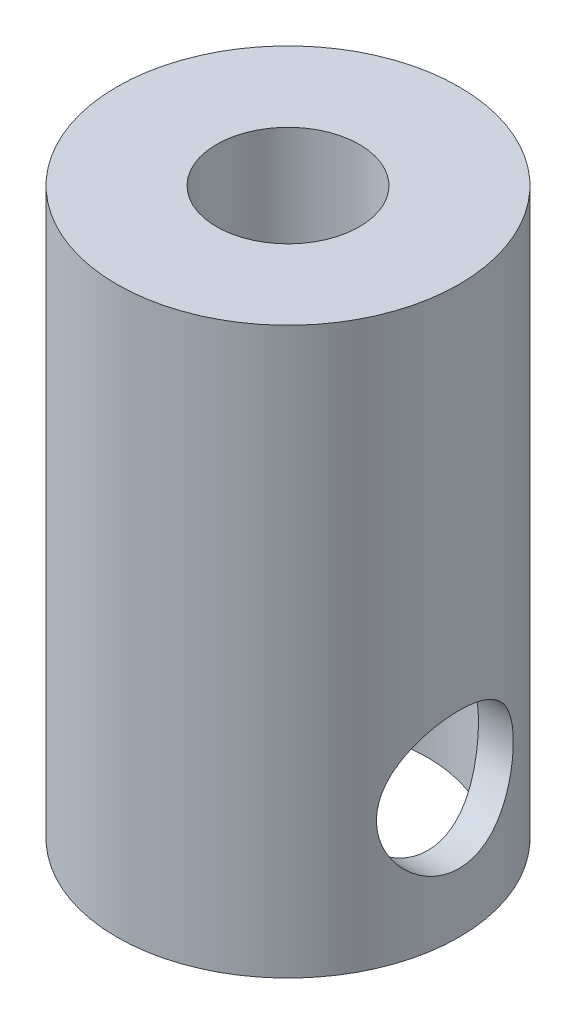
ISO-10303-21;
HEADER;
FILE_DESCRIPTION(('STEP AP214'),'2;1');
FILE_NAME('part.step','',(''),(''),'','','');
FILE_SCHEMA(('AUTOMOTIVE_DESIGN { 1 0 10303 214 1 1 1 1 }'));
ENDSEC;
DATA;
#1=APPLICATION_CONTEXT('core data for automotive mechanical design processes');
#2=APPLICATION_PROTOCOL_DEFINITION('international standard','automotive_design',2000,#1);
#3=PRODUCT_CONTEXT('',#1,'mechanical');
#4=PRODUCT('Part','Part','',(#3));
#5=PRODUCT_RELATED_PRODUCT_CATEGORY('part','',(#4));
#6=PRODUCT_DEFINITION_FORMATION('','',#4);
#7=PRODUCT_DEFINITION_CONTEXT('part definition',#1,'design');
#8=PRODUCT_DEFINITION('design','',#6,#7);
#9=PRODUCT_DEFINITION_SHAPE('','',#8);
#10=(LENGTH_UNIT() NAMED_UNIT(*) SI_UNIT(.MILLI.,.METRE.));
#11=(NAMED_UNIT(*) PLANE_ANGLE_UNIT() SI_UNIT($,.RADIAN.));
#12=(NAMED_UNIT(*) SI_UNIT($,.STERADIAN.) SOLID_ANGLE_UNIT());
#13=UNCERTAINTY_MEASURE_WITH_UNIT(LENGTH_MEASURE(1.E-05),#10,'distance_accuracy_value','');
#14=(GEOMETRIC_REPRESENTATION_CONTEXT(3) GLOBAL_UNCERTAINTY_ASSIGNED_CONTEXT((#13)) GLOBAL_UNIT_ASSIGNED_CONTEXT((#10,
#11,#12)) REPRESENTATION_CONTEXT('',''));
#15=CARTESIAN_POINT('',(0.,0.,0.));
#16=DIRECTION('',(0.,0.,1.));
#17=DIRECTION('',(1.,0.,0.));
#18=AXIS2_PLACEMENT_3D('',#15,#16,#17);
#19=CARTESIAN_POINT('',(0.,0.,0.));
#20=DIRECTION('',(0.,1.,0.));
#21=DIRECTION('',(0.,0.,1.));
#22=AXIS2_PLACEMENT_3D('',#19,#20,#21);
#23=PLANE('',#22);
#24=CARTESIAN_POINT('',(0.,0.,0.));
#25=DIRECTION('',(0.,1.,0.));
#26=DIRECTION('',(0.,0.,1.));
#27=AXIS2_PLACEMENT_3D('',#24,#25,#26);
#28=CIRCLE('',#27,5.75);
#29=CARTESIAN_POINT('',(0.,0.,5.75));
#30=VERTEX_POINT('',#29);
#31=EDGE_CURVE('E46',#30,#30,#28,.T.);
#32=ORIENTED_EDGE('',*,*,#31,.F.);
#33=EDGE_LOOP('',(#32));
#34=FACE_BOUND('',#33,.T.);
#35=CARTESIAN_POINT('',(0.,0.,0.));
#36=DIRECTION('',(0.,1.,0.));
#37=DIRECTION('',(0.,0.,1.));
#38=AXIS2_PLACEMENT_3D('',#35,#36,#37);
#39=CIRCLE('',#38,4.7);
#40=CARTESIAN_POINT('',(0.,0.,4.7));
#41=VERTEX_POINT('',#40);
#42=EDGE_CURVE('E50',#41,#41,#39,.T.);
#43=ORIENTED_EDGE('',*,*,#42,.T.);
#44=EDGE_LOOP('',(#43));
#45=FACE_BOUND('',#44,.T.);
#46=ADVANCED_FACE('F37',(#34,#45),#23,.F.);
#47=CARTESIAN_POINT('',(0.,10.,0.));
#48=DIRECTION('',(0.,-1.,0.));
#49=DIRECTION('',(0.,0.,-1.));
#50=AXIS2_PLACEMENT_3D('',#47,#48,#49);
#51=CYLINDRICAL_SURFACE('',#50,5.75);
#52=CARTESIAN_POINT('',(-5.75,2.,0.));
#53=CARTESIAN_POINT('',(-5.74999388438572,2.00000823723326,-0.123624281690028));
#54=CARTESIAN_POINT('',(-5.74596749221181,2.01002458534458,-0.247450413823076));
#55=CARTESIAN_POINT('',(-5.73025910132103,2.04973569086473,-0.491618982012242));
#56=CARTESIAN_POINT('',(-5.71855629199848,2.07948394351581,-0.61195101696212));
#57=CARTESIAN_POINT('',(-5.68875356845851,2.15740726792573,-0.84519753665279));
#58=CARTESIAN_POINT('',(-5.67067461178497,2.20552201363269,-0.95813490184691));
#59=CARTESIAN_POINT('',(-5.62990098057188,2.31857210882144,-1.17423262493911));
#60=CARTESIAN_POINT('',(-5.60720790886076,2.38350161941107,-1.27739635975919));
#61=CARTESIAN_POINT('',(-5.55830520337794,2.53157080639289,-1.47602619886361));
#62=CARTESIAN_POINT('',(-5.53198641801866,2.6153726501264,-1.5709716242109));
#63=CARTESIAN_POINT('',(-5.47929663108664,2.79741000855041,-1.74590124471902));
#64=CARTESIAN_POINT('',(-5.4529256103072,2.89565254303769,-1.82587812025623));
#65=CARTESIAN_POINT('',(-5.40181210661904,3.10909227947905,-1.97210575546531));
#66=CARTESIAN_POINT('',(-5.37719433385157,3.22484945857908,-2.03758722919821));
#67=CARTESIAN_POINT('',(-5.33408694239361,3.46686685853048,-2.1479179260697));
#68=CARTESIAN_POINT('',(-5.31559441424131,3.59312205711668,-2.19277694871298));
#69=CARTESIAN_POINT('',(-5.2880031131631,3.84656918354398,-2.25848364711119));
#70=CARTESIAN_POINT('',(-5.27851633410648,3.97345892088941,-2.28032806073153));
#71=CARTESIAN_POINT('',(-5.26888604654814,4.22943024807658,-2.30249890583102));
#72=CARTESIAN_POINT('',(-5.26873794350743,4.35851072882478,-2.30283591874596));
#73=CARTESIAN_POINT('',(-5.27747075322403,4.60562017217116,-2.28273777264348));
#74=CARTESIAN_POINT('',(-5.28572401294327,4.72379307156889,-2.26374661145446));
#75=CARTESIAN_POINT('',(-5.30927615748901,4.95510848940922,-2.20793891233894));
#76=CARTESIAN_POINT('',(-5.32457627169894,5.06825012632726,-2.17111926402436));
#77=CARTESIAN_POINT('',(-5.3608340785184,5.28902051162503,-2.07999894243471));
#78=CARTESIAN_POINT('',(-5.38190086172914,5.39648962491278,-2.02535684166288));
#79=CARTESIAN_POINT('',(-5.42728833848365,5.60112818881591,-1.90038242984178));
#80=CARTESIAN_POINT('',(-5.45161025275373,5.69829375081326,-1.8300442258659));
#81=CARTESIAN_POINT('',(-5.50305747253614,5.88747118812226,-1.66928318937268));
#82=CARTESIAN_POINT('',(-5.53025414722575,5.97850403886291,-1.57772808241625));
#83=CARTESIAN_POINT('',(-5.58278798702024,6.14423714970235,-1.3803615915447));
#84=CARTESIAN_POINT('',(-5.60812478112123,6.21893415702184,-1.27454737513459));
#85=CARTESIAN_POINT('',(-5.65471883454231,6.3511600645282,-1.04888930049672));
#86=CARTESIAN_POINT('',(-5.67588560609727,6.40832062337661,-0.92880956504845));
#87=CARTESIAN_POINT('',(-5.71107052578073,6.50129304023976,-0.679677330305312));
#88=CARTESIAN_POINT('',(-5.72509230481739,6.53711574319102,-0.550629426377123));
#89=CARTESIAN_POINT('',(-5.74374560432947,6.58441553973266,-0.295430270748995));
#90=CARTESIAN_POINT('',(-5.74888387708541,6.59720832239159,-0.169559788083372));
#91=CARTESIAN_POINT('',(-5.75078750287226,6.60197006560791,0.0826221062789962));
#92=CARTESIAN_POINT('',(-5.74755502619635,6.59394442377964,0.208933395207536));
#93=CARTESIAN_POINT('',(-5.73341202123316,6.55826448456521,0.452447649990263));
#94=CARTESIAN_POINT('',(-5.72285300047352,6.53150832259637,0.569804865541712));
#95=CARTESIAN_POINT('',(-5.69548357616325,6.46034893544372,0.798255742269981));
#96=CARTESIAN_POINT('',(-5.67867236960011,6.41594344338103,0.909348596758883));
#97=CARTESIAN_POINT('',(-5.63979083986433,6.30929731936804,1.12594060368889));
#98=CARTESIAN_POINT('',(-5.61757538376771,6.24655270715032,1.2311647261675));
#99=CARTESIAN_POINT('',(-5.57029369457356,6.10556862750857,1.42996012993476));
#100=CARTESIAN_POINT('',(-5.5452263207682,6.02732295063921,1.52352671687984));
#101=CARTESIAN_POINT('',(-5.49291885283818,5.8514994851077,1.70283149947829));
#102=CARTESIAN_POINT('',(-5.46564457638771,5.75298642726699,1.78764502385833));
#103=CARTESIAN_POINT('',(-5.41352923854741,5.5426439045401,1.93976387704442));
#104=CARTESIAN_POINT('',(-5.38868857855634,5.43081224961232,2.00706632060789));
#105=CARTESIAN_POINT('',(-5.34421444893717,5.19531905121349,2.12267862715094));
#106=CARTESIAN_POINT('',(-5.32463375516953,5.0715534008935,2.17079818345054));
#107=CARTESIAN_POINT('',(-5.29372224500174,4.8166563005399,2.24514065292499));
#108=CARTESIAN_POINT('',(-5.2823853405246,4.68553036336174,2.27137972704455));
#109=CARTESIAN_POINT('',(-5.27012523193001,4.42980291291656,2.29967295895619));
#110=CARTESIAN_POINT('',(-5.26851134152493,4.30541093431357,2.30333164135124));
#111=CARTESIAN_POINT('',(-5.27407061444965,4.05787341378377,2.29057363646579));
#112=CARTESIAN_POINT('',(-5.28124266199209,3.93472771558553,2.27415949837282));
#113=CARTESIAN_POINT('',(-5.30295646416193,3.69816798111588,2.22303205929002));
#114=CARTESIAN_POINT('',(-5.31719556511163,3.58456168238444,2.18906807443321));
#115=CARTESIAN_POINT('',(-5.35122601508029,3.36461457796266,2.10450630895001));
#116=CARTESIAN_POINT('',(-5.37101889723977,3.25827578858786,2.05390393457494));
#117=CARTESIAN_POINT('',(-5.41533400688796,3.04924892988522,1.93415350698494));
#118=CARTESIAN_POINT('',(-5.44006213295024,2.94711849888154,1.8641094834618));
#119=CARTESIAN_POINT('',(-5.49083376393689,2.75555771569328,1.70877658933061));
#120=CARTESIAN_POINT('',(-5.51687766362374,2.66613120602306,1.62348312381659));
#121=CARTESIAN_POINT('',(-5.56937596712702,2.49656659738689,1.43347873531877));
#122=CARTESIAN_POINT('',(-5.59574750748622,2.41740663044838,1.3278674164758));
#123=CARTESIAN_POINT('',(-5.64420488638369,2.27791286782054,1.10389535780536));
#124=CARTESIAN_POINT('',(-5.6662887300379,2.21758782732703,0.985528723103568));
#125=CARTESIAN_POINT('',(-5.70330595248464,2.11888273874964,0.74141209988682));
#126=CARTESIAN_POINT('',(-5.71836483360009,2.08011493621989,0.615840659764967));
#127=CARTESIAN_POINT('',(-5.73472932749896,2.03841556145961,0.423725648956378));
#128=CARTESIAN_POINT('',(-5.73914567299212,2.02726048085496,0.359120690297922));
#129=CARTESIAN_POINT('',(-5.74580111029469,2.0105029399513,0.229094759724269));
#130=CARTESIAN_POINT('',(-5.74804174957562,2.00489653310221,0.163674401354879));
#131=CARTESIAN_POINT('',(-5.74972136963039,2.00069732496798,0.0654539113447003));
#132=CARTESIAN_POINT('',(-5.75000161933165,1.99999781889245,0.0327340317264873));
#133=CARTESIAN_POINT('',(-5.75,2.,0.));
#134=B_SPLINE_CURVE_WITH_KNOTS('',3,(#52,#53,#54,#55,#56,#57,#58,#59,#60,#61,#62,#63,#64,#65,
#66,#67,#68,#69,#70,#71,#72,#73,#74,#75,#76,#77,#78,#79,#80,#81,#82,#83,#84,#85,#86,#87,#88,#89,
#90,#91,#92,#93,#94,#95,#96,#97,#98,#99,#100,#101,#102,#103,#104,#105,#106,#107,#108,#109,#110,
#111,#112,#113,#114,#115,#116,#117,#118,#119,#120,#121,#122,#123,#124,#125,#126,#127,#128,#129,
#130,#131,#132,#133),.UNSPECIFIED.,.T.,.F.,(4,2,2,2,2,2,2,2,2,2,2,2,2,2,2,2,2,2,2,2,2,2,2,2,2,2,
2,2,2,2,2,2,2,2,2,2,2,2,2,2,4),(0.,0.370763436077032,0.742536181409125,1.11309817609232,
1.48353166603182,1.86986988955457,2.25639654174573,2.66012547642099,3.06366236586008,
3.44889721105153,3.83394252291561,4.19219077661578,4.55050155344455,4.91612495243638,
5.28188585228911,5.6759210156454,6.07003456765693,6.47193450137227,6.87362999530859,
7.25154562207208,7.62936327605594,7.9902052389902,8.35109356342866,8.72302040408002,
9.09509653423814,9.49173745818076,9.8884436940031,10.2889930191195,10.6892462354282,
11.0606962440166,11.432099084475,11.7888146633108,12.1456288117594,12.522872882652,
12.9002308155065,13.3020548706391,13.7040654318661,14.0985894616532,14.2954982024388,
14.4922667890321,14.5904399141953),.UNSPECIFIED.);
#135=CARTESIAN_POINT('',(-5.75,2.,0.));
#136=VERTEX_POINT('',#135);
#137=EDGE_CURVE('E86',#136,#136,#134,.T.);
#138=ORIENTED_EDGE('',*,*,#137,.T.);
#139=EDGE_LOOP('',(#138));
#140=FACE_BOUND('',#139,.T.);
#141=CARTESIAN_POINT('',(5.26996204919922,4.3,-2.3));
#142=CARTESIAN_POINT('',(5.26996726196697,4.1768077568301,-2.29999471078226));
#143=CARTESIAN_POINT('',(5.27434198866691,4.05340976151838,-2.29004299586418));
#144=CARTESIAN_POINT('',(5.2912774580259,3.81017005328549,-2.25062717506047));
#145=CARTESIAN_POINT('',(5.30385911722599,3.6903382475107,-2.22111320887192));
#146=CARTESIAN_POINT('',(5.33554472327105,3.45814041968355,-2.14387087647648));
#147=CARTESIAN_POINT('',(5.35462406900014,3.3457481202151,-2.09621113348333));
#148=CARTESIAN_POINT('',(5.39711878767204,3.13058184190836,-1.98423315173275));
#149=CARTESIAN_POINT('',(5.42053321353703,3.02780576959728,-1.91991855031363));
#150=CARTESIAN_POINT('',(5.47055990796686,2.82885063827402,-1.77252031636742));
#151=CARTESIAN_POINT('',(5.49727504575997,2.73329014069317,-1.68863627362034));
#152=CARTESIAN_POINT('',(5.55004326602569,2.55714162601583,-1.50616545940198));
#153=CARTESIAN_POINT('',(5.57609611440526,2.47655884113384,-1.40757357158949));
#154=CARTESIAN_POINT('',(5.62583918787604,2.32958265114383,-1.19370726037898));
#155=CARTESIAN_POINT('',(5.64939574154456,2.26387405536117,-1.07792831138196));
#156=CARTESIAN_POINT('',(5.69024516857893,2.15312989430014,-0.835849120378933));
#157=CARTESIAN_POINT('',(5.70754059013737,2.1080859168138,-0.709553184438415));
#158=CARTESIAN_POINT('',(5.733190737392,2.04215729110795,-0.456511391095716));
#159=CARTESIAN_POINT('',(5.74193777286222,2.02020858893425,-0.330083332587063));
#160=CARTESIAN_POINT('',(5.75092357290545,1.99766724135133,-0.0750562778715557));
#161=CARTESIAN_POINT('',(5.7511655108614,1.99706663063933,0.0535418907153235));
#162=CARTESIAN_POINT('',(5.74335257243704,2.01665518527483,0.301567368907403));
#163=CARTESIAN_POINT('',(5.73576296287208,2.03567848866792,0.421104070801026));
#164=CARTESIAN_POINT('',(5.71376685189512,2.09199180774842,0.655124075605201));
#165=CARTESIAN_POINT('',(5.69935985029543,2.12928316375823,0.769607007049925));
#166=CARTESIAN_POINT('',(5.66486348126087,2.22153195531,0.992332629287142));
#167=CARTESIAN_POINT('',(5.64469174536157,2.27674717203769,1.10045526688573));
#168=CARTESIAN_POINT('',(5.60066772957316,2.40303475795703,1.30617937335251));
#169=CARTESIAN_POINT('',(5.57681418907222,2.47411256206519,1.40377721912566));
#170=CARTESIAN_POINT('',(5.52599882752541,2.63554650633546,1.5924841521887));
#171=CARTESIAN_POINT('',(5.49893575488522,2.72686197645872,1.68274652205627));
#172=CARTESIAN_POINT('',(5.44595910119252,2.9234391576068,1.84702352770155));
#173=CARTESIAN_POINT('',(5.42004589859288,3.02870541542495,1.92103284535503));
#174=CARTESIAN_POINT('',(5.37161432020377,3.25398187573003,2.05263981702716));
#175=CARTESIAN_POINT('',(5.34921251166364,3.37432455488945,2.1097148493817));
#176=CARTESIAN_POINT('',(5.31170728895697,3.62404781385905,2.20245269884643));
#177=CARTESIAN_POINT('',(5.29659913575007,3.75342246243558,2.23812942313468));
#178=CARTESIAN_POINT('',(5.27654223658123,4.00909114408755,2.28499819118313));
#179=CARTESIAN_POINT('',(5.27102921424558,4.13509051419784,2.29755291133672));
#180=CARTESIAN_POINT('',(5.26917922549394,4.38748878892349,2.30179552540932));
#181=CARTESIAN_POINT('',(5.27283947644416,4.513887560767,2.29348974717998));
#182=CARTESIAN_POINT('',(5.28834451012981,4.75592777520048,2.25748782900854));
#183=CARTESIAN_POINT('',(5.29971126468047,4.87177187801007,2.23092302132744));
#184=CARTESIAN_POINT('',(5.32875558681441,5.09728166550327,2.1606248149475));
#185=CARTESIAN_POINT('',(5.34643455361888,5.20694597407322,2.11688760944762));
#186=CARTESIAN_POINT('',(5.38698849139116,5.421942711465,2.01150598540381));
#187=CARTESIAN_POINT('',(5.41004510335054,5.52691911699872,1.94920729850434));
#188=CARTESIAN_POINT('',(5.45847942931464,5.72540543555783,1.80914000810809));
#189=CARTESIAN_POINT('',(5.48385808630452,5.81891065371476,1.73136510450418));
#190=CARTESIAN_POINT('',(5.53634053367129,5.99897941988928,1.55577084343266));
#191=CARTESIAN_POINT('',(5.56343328378018,6.08452005008534,1.45689524386225));
#192=CARTESIAN_POINT('',(5.61452763752662,6.23795363810124,1.24554617837378));
#193=CARTESIAN_POINT('',(5.63852911532106,6.30584587758439,1.1330721592366));
#194=CARTESIAN_POINT('',(5.68081273285448,6.42180477043284,0.897321924103467));
#195=CARTESIAN_POINT('',(5.69909624176759,6.46987617079971,0.774048303148556));
#196=CARTESIAN_POINT('',(5.7278362048924,6.54428118025972,0.520252629551729));
#197=CARTESIAN_POINT('',(5.73829690662019,6.57062658662229,0.389734551818342));
#198=CARTESIAN_POINT('',(5.74975859443637,6.59943040690077,0.134338986917007));
#199=CARTESIAN_POINT('',(5.75133223762207,6.60333514784633,0.00964906654990021));
#200=CARTESIAN_POINT('',(5.74638948729779,6.59096619870901,-0.238548911161105));
#201=CARTESIAN_POINT('',(5.7398743184109,6.57469556312108,-0.362057144556544));
#202=CARTESIAN_POINT('',(5.71977240389111,6.52347119380013,-0.600496536993406));
#203=CARTESIAN_POINT('',(5.70640902803847,6.48910671352996,-0.715574624444598));
#204=CARTESIAN_POINT('',(5.67404189932462,6.40328927323677,-0.938310708873993));
#205=CARTESIAN_POINT('',(5.65503710622288,6.35183316142004,-1.04596733286749));
#206=CARTESIAN_POINT('',(5.61220808803647,6.23073132764378,-1.25603349462593));
#207=CARTESIAN_POINT('',(5.5882080029028,6.1603822833761,-1.35800093146549));
#208=CARTESIAN_POINT('',(5.53827812561142,6.00454318044096,-1.54911214617012));
#209=CARTESIAN_POINT('',(5.5123475373389,5.91904685495055,-1.63825058857695));
#210=CARTESIAN_POINT('',(5.45948432472832,5.72908758112404,-1.80688140178617));
#211=CARTESIAN_POINT('',(5.4325890431231,5.62377813858429,-1.88543501653191));
#212=CARTESIAN_POINT('',(5.38257105378362,5.40061619892105,-2.02382477177622));
#213=CARTESIAN_POINT('',(5.35944878974765,5.28276222927842,-2.08365871164132));
#214=CARTESIAN_POINT('',(5.32172751374923,5.04860838555927,-2.17808905719379));
#215=CARTESIAN_POINT('',(5.30654961182477,4.93311915688069,-2.21446916015057));
#216=CARTESIAN_POINT('',(5.28362699939238,4.69733760228346,-2.26862789567763));
#217=CARTESIAN_POINT('',(5.27586158134,4.57705964056199,-2.28645836120349));
#218=CARTESIAN_POINT('',(5.27150528533404,4.43020502502175,-2.2964603251334));
#219=CARTESIAN_POINT('',(5.27092760784877,4.4041882975901,-2.29778660364679));
#220=CARTESIAN_POINT('',(5.27015542431131,4.35211745168319,-2.29955703292888));
#221=CARTESIAN_POINT('',(5.26996094635308,4.32606333060657,-2.30000111902038));
#222=CARTESIAN_POINT('',(5.26996204919922,4.3,-2.3));
#223=B_SPLINE_CURVE_WITH_KNOTS('',3,(#141,#142,#143,#144,#145,#146,#147,#148,#149,#150,#151,
#152,#153,#154,#155,#156,#157,#158,#159,#160,#161,#162,#163,#164,#165,#166,#167,#168,#169,#170,
#171,#172,#173,#174,#175,#176,#177,#178,#179,#180,#181,#182,#183,#184,#185,#186,#187,#188,#189,
#190,#191,#192,#193,#194,#195,#196,#197,#198,#199,#200,#201,#202,#203,#204,#205,#206,#207,#208,
#209,#210,#211,#212,#213,#214,#215,#216,#217,#218,#219,#220,#221,#222),.UNSPECIFIED.,.T.,.F.,(4,
2,2,2,2,2,2,2,2,2,2,2,2,2,2,2,2,2,2,2,2,2,2,2,2,2,2,2,2,2,2,2,2,2,2,2,2,2,2,2,4),(0.,
0.369469296082802,0.739883936195583,1.1089114467874,1.47785843147441,1.86593961027088,
2.25415610500594,2.65768069455142,3.06104087014902,3.44487310320261,3.82856212101523,
4.19069941554848,4.55286328398418,4.92048545270133,5.28823377181036,5.68012650693559,
6.07214728196196,6.47524127524846,6.87807300520117,7.25629469653083,7.6344016714413,
7.99097335297917,8.34762412449383,8.71873827850606,9.09000381704727,9.48869294384026,
9.8873982958066,10.2860081040973,10.6844013234726,11.0568019571935,11.4291462173949,
11.7900529360985,12.1510262450287,12.5279510881091,12.9050322404884,13.3054569127846,
13.7059286402307,14.0704415994194,14.4339332475213,14.5120947799104,14.5902620424344),.UNSPECIFIED.);
#224=CARTESIAN_POINT('',(5.26996204919922,4.3,-2.3));
#225=VERTEX_POINT('',#224);
#226=EDGE_CURVE('E61',#225,#225,#223,.T.);
#227=ORIENTED_EDGE('',*,*,#226,.T.);
#228=EDGE_LOOP('',(#227));
#229=FACE_BOUND('',#228,.T.);
#230=ORIENTED_EDGE('',*,*,#31,.T.);
#231=EDGE_LOOP('',(#230));
#232=FACE_BOUND('',#231,.T.);
#233=CARTESIAN_POINT('',(0.,19.,0.));
#234=DIRECTION('',(0.,1.,0.));
#235=DIRECTION('',(0.,0.,1.));
#236=AXIS2_PLACEMENT_3D('',#233,#234,#235);
#237=CIRCLE('',#236,5.75);
#238=CARTESIAN_POINT('',(0.,19.,5.75));
#239=VERTEX_POINT('',#238);
#240=EDGE_CURVE('E87',#239,#239,#237,.T.);
#241=ORIENTED_EDGE('',*,*,#240,.F.);
#242=EDGE_LOOP('',(#241));
#243=FACE_BOUND('',#242,.T.);
#244=ADVANCED_FACE('F39',(#140,#229,#232,#243),#51,.T.);
#245=CARTESIAN_POINT('',(0.,10.,0.));
#246=DIRECTION('',(0.,-1.,0.));
#247=DIRECTION('',(0.,0.,-1.));
#248=AXIS2_PLACEMENT_3D('',#245,#246,#247);
#249=CYLINDRICAL_SURFACE('',#248,4.7);
#250=CARTESIAN_POINT('',(0.,9.5,0.));
#251=DIRECTION('',(0.,-1.,0.));
#252=DIRECTION('',(0.,0.,-1.));
#253=AXIS2_PLACEMENT_3D('',#250,#251,#252);
#254=CIRCLE('',#253,4.7);
#255=CARTESIAN_POINT('',(0.,9.5,-4.7));
#256=VERTEX_POINT('',#255);
#257=EDGE_CURVE('E10',#256,#256,#254,.T.);
#258=ORIENTED_EDGE('',*,*,#257,.F.);
#259=EDGE_LOOP('',(#258));
#260=FACE_BOUND('',#259,.T.);
#261=CARTESIAN_POINT('',(-4.09878030638384,4.3,-2.3));
#262=CARTESIAN_POINT('',(-4.09879130410926,4.42023705760669,-2.29999076994393));
#263=CARTESIAN_POINT('',(-4.10415132223401,4.54063937182244,-2.29050840458859));
#264=CARTESIAN_POINT('',(-4.12482933221712,4.77777763373259,-2.25304496904506));
#265=CARTESIAN_POINT('',(-4.14016913231418,4.89450496365335,-2.22502338389741));
#266=CARTESIAN_POINT('',(-4.17860598413637,5.12042244717567,-2.15195968419019));
#267=CARTESIAN_POINT('',(-4.20166309183101,5.22964799071185,-2.10700506612406));
#268=CARTESIAN_POINT('',(-4.25287540857191,5.43897987715292,-2.0016174213812));
#269=CARTESIAN_POINT('',(-4.28103070514529,5.5390860634498,-1.94118412895491));
#270=CARTESIAN_POINT('',(-4.34198223432814,5.73605951203057,-1.8009649619063));
#271=CARTESIAN_POINT('',(-4.37496934901051,5.83204948107073,-1.7200291216423));
#272=CARTESIAN_POINT('',(-4.4403240545888,6.00977065528835,-1.5434969178962));
#273=CARTESIAN_POINT('',(-4.47269134071164,6.09149499851925,-1.4478935404575));
#274=CARTESIAN_POINT('',(-4.53563508247928,6.24347006044052,-1.2372692031465));
#275=CARTESIAN_POINT('',(-4.5659649280642,6.31265386670373,-1.12139781194677));
#276=CARTESIAN_POINT('',(-4.61895805936829,6.43014835780763,-0.877899505936132));
#277=CARTESIAN_POINT('',(-4.64162598213645,6.47847167248906,-0.750279761035784));
#278=CARTESIAN_POINT('',(-4.67536880953801,6.54943947852573,-0.496191585537989));
#279=CARTESIAN_POINT('',(-4.68713266060183,6.57361889244346,-0.370245403574587));
#280=CARTESIAN_POINT('',(-4.70030457254946,6.60065457926746,-0.115575790767315));
#281=CARTESIAN_POINT('',(-4.70171859939604,6.60352313643318,0.0131459972020458));
#282=CARTESIAN_POINT('',(-4.69436916911429,6.58847730306153,0.258225669921864));
#283=CARTESIAN_POINT('',(-4.68644452604503,6.57227594595719,0.374719511980497));
#284=CARTESIAN_POINT('',(-4.66256035407486,6.52259805088752,0.603088113824243));
#285=CARTESIAN_POINT('',(-4.64660022581925,6.48912022429177,0.714962528379638));
#286=CARTESIAN_POINT('',(-4.60783216636392,6.40558803728292,0.932910017660707));
#287=CARTESIAN_POINT('',(-4.58492983255214,6.35530410705337,1.03887761814314));
#288=CARTESIAN_POINT('',(-4.53436555547376,6.23988654815575,1.2411337059924));
#289=CARTESIAN_POINT('',(-4.50670188850805,6.17474753886273,1.33741866797868));
#290=CARTESIAN_POINT('',(-4.44624834184569,6.02460715635675,1.52697616686913));
#291=CARTESIAN_POINT('',(-4.41322101835652,5.93833342486081,1.61916613399816));
#292=CARTESIAN_POINT('',(-4.34742429961778,5.75179705245864,1.78833935421543));
#293=CARTESIAN_POINT('',(-4.31465510423,5.65152451911085,1.8653117598534));
#294=CARTESIAN_POINT('',(-4.25101796523448,5.43258277080888,2.00628548898374));
#295=CARTESIAN_POINT('',(-4.22037559492736,5.31317796484872,2.06925614053423));
#296=CARTESIAN_POINT('',(-4.16753048291045,5.06360804397095,2.1737418044637));
#297=CARTESIAN_POINT('',(-4.14531925678148,4.93345390780866,2.21527840155056));
#298=CARTESIAN_POINT('',(-4.11425076042612,4.67679711009106,2.27242788477963));
#299=CARTESIAN_POINT('',(-4.10448651195521,4.55080233837599,2.28981110031025));
#300=CARTESIAN_POINT('',(-4.09682909863237,4.2973464035207,2.30349078761872));
#301=CARTESIAN_POINT('',(-4.09892832519582,4.16988623254992,2.29980077459782));
#302=CARTESIAN_POINT('',(-4.11380100597445,3.93103943959372,2.27306345516932));
#303=CARTESIAN_POINT('',(-4.12545711100364,3.81934548254385,2.25204118747097));
#304=CARTESIAN_POINT('',(-4.15650885347452,3.60126474504707,2.19419764649285));
#305=CARTESIAN_POINT('',(-4.1759068703356,3.49487960754613,2.15737151575039));
#306=CARTESIAN_POINT('',(-4.22131997708824,3.2848340397741,2.06715037815268));
#307=CARTESIAN_POINT('',(-4.24760049389679,3.18152949192776,2.01306542955652));
#308=CARTESIAN_POINT('',(-4.30356265080624,2.98487416858709,1.89047256439442));
#309=CARTESIAN_POINT('',(-4.33324602106298,2.89152850359613,1.82195729588423));
#310=CARTESIAN_POINT('',(-4.39694275105103,2.70575692738545,1.66285183732137));
#311=CARTESIAN_POINT('',(-4.43104908741215,2.61477871916784,1.57060093713983));
#312=CARTESIAN_POINT('',(-4.49664314266213,2.44916577343944,1.37156007972616));
#313=CARTESIAN_POINT('',(-4.52813009098762,2.37453583474028,1.26476586838131));
#314=CARTESIAN_POINT('',(-4.58586751246537,2.24238065278711,1.03633246210729));
#315=CARTESIAN_POINT('',(-4.61198556607114,2.18527392005786,0.914415349947775));
#316=CARTESIAN_POINT('',(-4.65504605350067,2.09293536224757,0.661060785872477));
#317=CARTESIAN_POINT('',(-4.67199620451543,2.05768513552254,0.529631446993498));
#318=CARTESIAN_POINT('',(-4.69362650112866,2.01297788741076,0.273644344609674));
#319=CARTESIAN_POINT('',(-4.69926642107445,2.00150025615106,0.149519652426554));
#320=CARTESIAN_POINT('',(-4.70059775471522,1.99877730440537,-0.0989875932418943));
#321=CARTESIAN_POINT('',(-4.69629235964243,2.00752549390041,-0.223370051220056));
#322=CARTESIAN_POINT('',(-4.67877614366312,2.04363817982267,-0.460840195933591));
#323=CARTESIAN_POINT('',(-4.66612826552479,2.06982682487814,-0.574152499119292));
#324=CARTESIAN_POINT('',(-4.63368299677901,2.13853458418368,-0.794609893980347));
#325=CARTESIAN_POINT('',(-4.61388453843334,2.18105613735484,-0.901754061846362));
#326=CARTESIAN_POINT('',(-4.56786016930315,2.28319248043901,-1.11209452052669));
#327=CARTESIAN_POINT('',(-4.5413904725432,2.34347507902611,-1.21491164611917));
#328=CARTESIAN_POINT('',(-4.48484634597713,2.47856897872954,-1.40940710616926));
#329=CARTESIAN_POINT('',(-4.45477025898168,2.55338696894126,-1.50108028055297));
#330=CARTESIAN_POINT('',(-4.39064021011313,2.72376227494674,-1.67992407562253));
#331=CARTESIAN_POINT('',(-4.35648108777707,2.82061937896061,-1.7658233390881));
#332=CARTESIAN_POINT('',(-4.2905096720648,3.02793568740525,-1.92057745575727));
#333=CARTESIAN_POINT('',(-4.25869932369418,3.13840596721245,-1.98941829168448));
#334=CARTESIAN_POINT('',(-4.20054767993268,3.373804980253,-2.10950164829272));
#335=CARTESIAN_POINT('',(-4.17436528643802,3.49902901855701,-2.16025435095232));
#336=CARTESIAN_POINT('',(-4.14299523855282,3.6929556602306,-2.219476376226));
#337=CARTESIAN_POINT('',(-4.13386055598427,3.75855034113999,-2.23639146318128));
#338=CARTESIAN_POINT('',(-4.11858109434076,3.89129535003845,-2.26440922175875));
#339=CARTESIAN_POINT('',(-4.11243419393832,3.95844453873434,-2.27551601769818));
#340=CARTESIAN_POINT('',(-4.10489853143308,4.07142768004335,-2.28907087753089));
#341=CARTESIAN_POINT('',(-4.10260987996268,4.11701216872381,-2.29316509116305));
#342=CARTESIAN_POINT('',(-4.09954862444941,4.20838976434354,-2.2986314964686));
#343=CARTESIAN_POINT('',(-4.09877611562877,4.25418288420499,-2.30000351717313));
#344=CARTESIAN_POINT('',(-4.09878030638384,4.3,-2.3));
#345=B_SPLINE_CURVE_WITH_KNOTS('',3,(#261,#262,#263,#264,#265,#266,#267,#268,#269,#270,#271,
#272,#273,#274,#275,#276,#277,#278,#279,#280,#281,#282,#283,#284,#285,#286,#287,#288,#289,#290,
#291,#292,#293,#294,#295,#296,#297,#298,#299,#300,#301,#302,#303,#304,#305,#306,#307,#308,#309,
#310,#311,#312,#313,#314,#315,#316,#317,#318,#319,#320,#321,#322,#323,#324,#325,#326,#327,#328,
#329,#330,#331,#332,#333,#334,#335,#336,#337,#338,#339,#340,#341,#342,#343,#344),.UNSPECIFIED.,
.T.,.F.,(4,2,2,2,2,2,2,2,2,2,2,2,2,2,2,2,2,2,2,2,2,2,2,2,2,2,2,2,2,2,2,2,2,2,2,2,2,2,2,2,2,4),
(0.,0.360526460723222,0.721843417344054,1.08131843096585,1.44079961673954,1.82861666544558,
2.21661974807311,2.62941711569161,3.04196420626806,3.42619404308026,3.81020238032769,
4.16219032263197,4.51420452307527,4.87123835768293,5.22840171869262,5.61825956545568,
6.00839431830992,6.42150166608662,6.83419218705443,7.21467186268264,7.59490754714234,
7.93612846954416,8.27745434453359,8.63462892909698,8.99198592870327,9.39212076340515,
9.79237289531067,10.2015499268282,10.6103819905502,10.9827393311381,11.3549772070665,
11.7043628949161,12.0538007752838,12.4185623340751,12.7834921531619,13.183360235355,
13.5835558161744,13.9938861456722,14.1986778664591,14.403323971811,14.5406963059711,
14.6780772676057),.UNSPECIFIED.);
#346=CARTESIAN_POINT('',(-4.09878030638384,4.3,-2.3));
#347=VERTEX_POINT('',#346);
#348=EDGE_CURVE('E53',#347,#347,#345,.T.);
#349=ORIENTED_EDGE('',*,*,#348,.F.);
#350=EDGE_LOOP('',(#349));
#351=FACE_BOUND('',#350,.T.);
#352=CARTESIAN_POINT('',(4.09878030638384,4.3,-2.3));
#353=CARTESIAN_POINT('',(4.09879130410926,4.17976294239331,-2.29999076994393));
#354=CARTESIAN_POINT('',(4.10415132223401,4.05936062817756,-2.29050840458859));
#355=CARTESIAN_POINT('',(4.12482933221712,3.82222236626741,-2.25304496904506));
#356=CARTESIAN_POINT('',(4.14016913231418,3.70549503634665,-2.22502338389741));
#357=CARTESIAN_POINT('',(4.17860598413637,3.47957755282433,-2.15195968419019));
#358=CARTESIAN_POINT('',(4.20166309183101,3.37035200928815,-2.10700506612406));
#359=CARTESIAN_POINT('',(4.25287540857191,3.16102012284708,-2.0016174213812));
#360=CARTESIAN_POINT('',(4.28103070514529,3.0609139365502,-1.94118412895491));
#361=CARTESIAN_POINT('',(4.34198223432814,2.86394048796943,-1.8009649619063));
#362=CARTESIAN_POINT('',(4.37496934901051,2.76795051892927,-1.7200291216423));
#363=CARTESIAN_POINT('',(4.4403240545888,2.59022934471165,-1.5434969178962));
#364=CARTESIAN_POINT('',(4.47269134071164,2.50850500148075,-1.4478935404575));
#365=CARTESIAN_POINT('',(4.53563508247928,2.35652993955948,-1.2372692031465));
#366=CARTESIAN_POINT('',(4.5659649280642,2.28734613329627,-1.12139781194677));
#367=CARTESIAN_POINT('',(4.61895805936829,2.16985164219237,-0.877899505936132));
#368=CARTESIAN_POINT('',(4.64162598213645,2.12152832751094,-0.750279761035784));
#369=CARTESIAN_POINT('',(4.67536880953801,2.05056052147427,-0.496191585537989));
#370=CARTESIAN_POINT('',(4.68713266060183,2.02638110755655,-0.370245403574586));
#371=CARTESIAN_POINT('',(4.70030457254946,1.99934542073254,-0.115575790767315));
#372=CARTESIAN_POINT('',(4.70171859939604,1.99647686356682,0.0131459972020464));
#373=CARTESIAN_POINT('',(4.69436916911429,2.01152269693847,0.258225669921864));
#374=CARTESIAN_POINT('',(4.68644452604503,2.02772405404281,0.374719511980498));
#375=CARTESIAN_POINT('',(4.66256035407486,2.07740194911248,0.603088113824244));
#376=CARTESIAN_POINT('',(4.64660022581925,2.11087977570823,0.714962528379639));
#377=CARTESIAN_POINT('',(4.60783216636391,2.19441196271708,0.932910017660708));
#378=CARTESIAN_POINT('',(4.58492983255214,2.24469589294663,1.03887761814314));
#379=CARTESIAN_POINT('',(4.53436555547376,2.36011345184425,1.2411337059924));
#380=CARTESIAN_POINT('',(4.50670188850805,2.42525246113727,1.33741866797868));
#381=CARTESIAN_POINT('',(4.44624834184569,2.57539284364325,1.52697616686913));
#382=CARTESIAN_POINT('',(4.41322101835652,2.66166657513919,1.61916613399816));
#383=CARTESIAN_POINT('',(4.34742429961778,2.84820294754136,1.78833935421543));
#384=CARTESIAN_POINT('',(4.31465510423,2.94847548088915,1.8653117598534));
#385=CARTESIAN_POINT('',(4.25101796523448,3.16741722919112,2.00628548898374));
#386=CARTESIAN_POINT('',(4.22037559492736,3.28682203515128,2.06925614053423));
#387=CARTESIAN_POINT('',(4.16753048291045,3.53639195602905,2.1737418044637));
#388=CARTESIAN_POINT('',(4.14531925678148,3.66654609219135,2.21527840155056));
#389=CARTESIAN_POINT('',(4.11425076042612,3.92320288990895,2.27242788477963));
#390=CARTESIAN_POINT('',(4.10448651195521,4.04919766162401,2.28981110031025));
#391=CARTESIAN_POINT('',(4.09682909863237,4.3026535964793,2.30349078761872));
#392=CARTESIAN_POINT('',(4.09892832519582,4.43011376745008,2.29980077459782));
#393=CARTESIAN_POINT('',(4.11380100597445,4.66896056040628,2.27306345516932));
#394=CARTESIAN_POINT('',(4.12545711100364,4.78065451745615,2.25204118747097));
#395=CARTESIAN_POINT('',(4.15650885347452,4.99873525495293,2.19419764649285));
#396=CARTESIAN_POINT('',(4.1759068703356,5.10512039245388,2.15737151575039));
#397=CARTESIAN_POINT('',(4.22131997708824,5.3151659602259,2.06715037815268));
#398=CARTESIAN_POINT('',(4.24760049389679,5.41847050807224,2.01306542955652));
#399=CARTESIAN_POINT('',(4.30356265080624,5.61512583141291,1.89047256439442));
#400=CARTESIAN_POINT('',(4.33324602106298,5.70847149640387,1.82195729588423));
#401=CARTESIAN_POINT('',(4.39694275105103,5.89424307261455,1.66285183732137));
#402=CARTESIAN_POINT('',(4.43104908741215,5.98522128083216,1.57060093713983));
#403=CARTESIAN_POINT('',(4.49664314266213,6.15083422656056,1.37156007972616));
#404=CARTESIAN_POINT('',(4.52813009098762,6.22546416525971,1.26476586838131));
#405=CARTESIAN_POINT('',(4.58586751246537,6.35761934721289,1.03633246210729));
#406=CARTESIAN_POINT('',(4.61198556607114,6.41472607994214,0.914415349947775));
#407=CARTESIAN_POINT('',(4.65504605350067,6.50706463775243,0.661060785872477));
#408=CARTESIAN_POINT('',(4.67199620451543,6.54231486447746,0.529631446993498));
#409=CARTESIAN_POINT('',(4.69362650112866,6.58702211258924,0.273644344609674));
#410=CARTESIAN_POINT('',(4.69926642107445,6.59849974384893,0.149519652426554));
#411=CARTESIAN_POINT('',(4.70059775471522,6.60122269559463,-0.0989875932418945));
#412=CARTESIAN_POINT('',(4.69629235964243,6.59247450609959,-0.223370051220056));
#413=CARTESIAN_POINT('',(4.67877614366312,6.55636182017733,-0.460840195933591));
#414=CARTESIAN_POINT('',(4.66612826552479,6.53017317512186,-0.574152499119292));
#415=CARTESIAN_POINT('',(4.63368299677901,6.46146541581632,-0.794609893980348));
#416=CARTESIAN_POINT('',(4.61388453843334,6.41894386264516,-0.901754061846363));
#417=CARTESIAN_POINT('',(4.56786016930315,6.31680751956099,-1.11209452052669));
#418=CARTESIAN_POINT('',(4.5413904725432,6.25652492097389,-1.21491164611917));
#419=CARTESIAN_POINT('',(4.48484634597713,6.12143102127046,-1.40940710616926));
#420=CARTESIAN_POINT('',(4.45477025898168,6.04661303105874,-1.50108028055297));
#421=CARTESIAN_POINT('',(4.39064021011313,5.87623772505325,-1.67992407562253));
#422=CARTESIAN_POINT('',(4.35648108777707,5.77938062103939,-1.7658233390881));
#423=CARTESIAN_POINT('',(4.2905096720648,5.57206431259474,-1.92057745575728));
#424=CARTESIAN_POINT('',(4.25869932369419,5.46159403278754,-1.98941829168448));
#425=CARTESIAN_POINT('',(4.20054767993268,5.226195019747,-2.10950164829272));
#426=CARTESIAN_POINT('',(4.17436528643802,5.10097098144299,-2.16025435095232));
#427=CARTESIAN_POINT('',(4.14299523855282,4.9070443397694,-2.219476376226));
#428=CARTESIAN_POINT('',(4.13386055598427,4.84144965886001,-2.23639146318127));
#429=CARTESIAN_POINT('',(4.11858109434076,4.70870464996155,-2.26440922175875));
#430=CARTESIAN_POINT('',(4.11243419393832,4.64155546126566,-2.27551601769818));
#431=CARTESIAN_POINT('',(4.10489853143308,4.52857231995665,-2.28907087753089));
#432=CARTESIAN_POINT('',(4.10260987996268,4.48298783127619,-2.29316509116305));
#433=CARTESIAN_POINT('',(4.09954862444941,4.39161023565646,-2.2986314964686));
#434=CARTESIAN_POINT('',(4.09877611562877,4.34581711579501,-2.30000351717313));
#435=CARTESIAN_POINT('',(4.09878030638384,4.3,-2.3));
#436=B_SPLINE_CURVE_WITH_KNOTS('',3,(#352,#353,#354,#355,#356,#357,#358,#359,#360,#361,#362,
#363,#364,#365,#366,#367,#368,#369,#370,#371,#372,#373,#374,#375,#376,#377,#378,#379,#380,#381,
#382,#383,#384,#385,#386,#387,#388,#389,#390,#391,#392,#393,#394,#395,#396,#397,#398,#399,#400,
#401,#402,#403,#404,#405,#406,#407,#408,#409,#410,#411,#412,#413,#414,#415,#416,#417,#418,#419,
#420,#421,#422,#423,#424,#425,#426,#427,#428,#429,#430,#431,#432,#433,#434,#435),.UNSPECIFIED.,
.T.,.F.,(4,2,2,2,2,2,2,2,2,2,2,2,2,2,2,2,2,2,2,2,2,2,2,2,2,2,2,2,2,2,2,2,2,2,2,2,2,2,2,2,2,4),
(0.,0.360526460723222,0.721843417344055,1.08131843096585,1.44079961673954,1.82861666544559,
2.21661974807311,2.62941711569161,3.04196420626806,3.42619404308026,3.81020238032769,
4.16219032263197,4.51420452307528,4.87123835768293,5.22840171869262,5.61825956545568,
6.00839431830992,6.42150166608662,6.83419218705443,7.21467186268264,7.59490754714234,
7.93612846954416,8.27745434453359,8.63462892909698,8.99198592870327,9.39212076340514,
9.79237289531066,10.2015499268282,10.6103819905502,10.9827393311381,11.3549772070665,
11.7043628949161,12.0538007752838,12.4185623340751,12.7834921531619,13.183360235355,
13.5835558161744,13.9938861456722,14.1986778664591,14.403323971811,14.5406963059711,
14.6780772676057),.UNSPECIFIED.);
#437=CARTESIAN_POINT('',(4.09878030638384,4.3,-2.3));
#438=VERTEX_POINT('',#437);
#439=EDGE_CURVE('E62',#438,#438,#436,.T.);
#440=ORIENTED_EDGE('',*,*,#439,.F.);
#441=EDGE_LOOP('',(#440));
#442=FACE_BOUND('',#441,.T.);
#443=ORIENTED_EDGE('',*,*,#42,.F.);
#444=EDGE_LOOP('',(#443));
#445=FACE_BOUND('',#444,.T.);
#446=ADVANCED_FACE('F66',(#260,#351,#442,#445),#249,.F.);
#447=CARTESIAN_POINT('',(-5.75,4.3,0.));
#448=DIRECTION('',(1.,0.,0.));
#449=DIRECTION('',(0.,0.,-1.));
#450=AXIS2_PLACEMENT_3D('',#447,#448,#449);
#451=CYLINDRICAL_SURFACE('',#450,2.3);
#452=ORIENTED_EDGE('',*,*,#439,.T.);
#453=EDGE_LOOP('',(#452));
#454=FACE_BOUND('',#453,.T.);
#455=ORIENTED_EDGE('',*,*,#226,.F.);
#456=EDGE_LOOP('',(#455));
#457=FACE_BOUND('',#456,.T.);
#458=ADVANCED_FACE('F73',(#454,#457),#451,.F.);
#459=ORIENTED_EDGE('',*,*,#348,.T.);
#460=EDGE_LOOP('',(#459));
#461=FACE_BOUND('',#460,.T.);
#462=ORIENTED_EDGE('',*,*,#137,.F.);
#463=EDGE_LOOP('',(#462));
#464=FACE_BOUND('',#463,.T.);
#465=ADVANCED_FACE('F68',(#461,#464),#451,.F.);
#466=CARTESIAN_POINT('',(0.,19.,0.));
#467=DIRECTION('',(0.,1.,0.));
#468=DIRECTION('',(0.,0.,1.));
#469=AXIS2_PLACEMENT_3D('',#466,#467,#468);
#470=PLANE('',#469);
#471=CARTESIAN_POINT('',(0.,19.,0.));
#472=DIRECTION('',(0.,1.,0.));
#473=DIRECTION('',(0.,0.,1.));
#474=AXIS2_PLACEMENT_3D('',#471,#472,#473);
#475=CIRCLE('',#474,2.4);
#476=CARTESIAN_POINT('',(0.,19.,-2.4));
#477=VERTEX_POINT('',#476);
#478=EDGE_CURVE('E42',#477,#477,#475,.F.);
#479=ORIENTED_EDGE('',*,*,#478,.T.);
#480=EDGE_LOOP('',(#479));
#481=FACE_BOUND('',#480,.T.);
#482=ORIENTED_EDGE('',*,*,#240,.T.);
#483=EDGE_LOOP('',(#482));
#484=FACE_BOUND('',#483,.T.);
#485=ADVANCED_FACE('F72',(#481,#484),#470,.T.);
#486=CARTESIAN_POINT('',(0.,9.5,0.));
#487=DIRECTION('',(0.,-1.,0.));
#488=DIRECTION('',(0.,0.,-1.));
#489=AXIS2_PLACEMENT_3D('',#486,#487,#488);
#490=PLANE('',#489);
#491=ORIENTED_EDGE('',*,*,#257,.T.);
#492=EDGE_LOOP('',(#491));
#493=FACE_BOUND('',#492,.T.);
#494=ADVANCED_FACE('F130',(#493),#490,.T.);
#495=CARTESIAN_POINT('',(0.,19.000012,0.));
#496=DIRECTION('',(0.,-1.,0.));
#497=DIRECTION('',(0.,0.,-1.));
#498=AXIS2_PLACEMENT_3D('',#495,#496,#497);
#499=CYLINDRICAL_SURFACE('',#498,2.4);
#500=CARTESIAN_POINT('',(0.,14.5,0.));
#501=DIRECTION('',(0.,1.,0.));
#502=DIRECTION('',(0.,0.,1.));
#503=AXIS2_PLACEMENT_3D('',#500,#501,#502);
#504=CIRCLE('',#503,2.4);
#505=CARTESIAN_POINT('',(0.,14.5,-2.4));
#506=VERTEX_POINT('',#505);
#507=EDGE_CURVE('E120',#506,#506,#504,.T.);
#508=CARTESIAN_POINT('',(0.,19.,-2.4));
#509=CARTESIAN_POINT('',(0.,18.953125,-2.4));
#510=CARTESIAN_POINT('',(0.,18.90625,-2.4));
#511=CARTESIAN_POINT('',(0.,18.8125,-2.4));
#512=CARTESIAN_POINT('',(0.,18.765625,-2.4));
#513=CARTESIAN_POINT('',(0.,18.671875,-2.4));
#514=CARTESIAN_POINT('',(0.,18.625,-2.4));
#515=CARTESIAN_POINT('',(0.,18.53125,-2.4));
#516=CARTESIAN_POINT('',(0.,18.484375,-2.4));
#517=CARTESIAN_POINT('',(0.,18.390625,-2.4));
#518=CARTESIAN_POINT('',(0.,18.34375,-2.4));
#519=CARTESIAN_POINT('',(0.,18.25,-2.4));
#520=CARTESIAN_POINT('',(0.,18.203125,-2.4));
#521=CARTESIAN_POINT('',(0.,18.109375,-2.4));
#522=CARTESIAN_POINT('',(0.,18.0625,-2.4));
#523=CARTESIAN_POINT('',(0.,17.96875,-2.4));
#524=CARTESIAN_POINT('',(0.,17.921875,-2.4));
#525=CARTESIAN_POINT('',(0.,17.828125,-2.4));
#526=CARTESIAN_POINT('',(0.,17.78125,-2.4));
#527=CARTESIAN_POINT('',(0.,17.6875,-2.4));
#528=CARTESIAN_POINT('',(0.,17.640625,-2.4));
#529=CARTESIAN_POINT('',(0.,17.546875,-2.4));
#530=CARTESIAN_POINT('',(0.,17.5,-2.4));
#531=CARTESIAN_POINT('',(0.,17.40625,-2.4));
#532=CARTESIAN_POINT('',(0.,17.359375,-2.4));
#533=CARTESIAN_POINT('',(0.,17.265625,-2.4));
#534=CARTESIAN_POINT('',(0.,17.21875,-2.4));
#535=CARTESIAN_POINT('',(0.,17.125,-2.4));
#536=CARTESIAN_POINT('',(0.,17.078125,-2.4));
#537=CARTESIAN_POINT('',(0.,16.984375,-2.4));
#538=CARTESIAN_POINT('',(0.,16.9375,-2.4));
#539=CARTESIAN_POINT('',(0.,16.84375,-2.4));
#540=CARTESIAN_POINT('',(0.,16.796875,-2.4));
#541=CARTESIAN_POINT('',(0.,16.703125,-2.4));
#542=CARTESIAN_POINT('',(0.,16.65625,-2.4));
#543=CARTESIAN_POINT('',(0.,16.5625,-2.4));
#544=CARTESIAN_POINT('',(0.,16.515625,-2.4));
#545=CARTESIAN_POINT('',(0.,16.421875,-2.4));
#546=CARTESIAN_POINT('',(0.,16.375,-2.4));
#547=CARTESIAN_POINT('',(0.,16.28125,-2.4));
#548=CARTESIAN_POINT('',(0.,16.234375,-2.4));
#549=CARTESIAN_POINT('',(0.,16.140625,-2.4));
#550=CARTESIAN_POINT('',(0.,16.09375,-2.4));
#551=CARTESIAN_POINT('',(0.,16.,-2.4));
#552=CARTESIAN_POINT('',(0.,15.953125,-2.4));
#553=CARTESIAN_POINT('',(0.,15.859375,-2.4));
#554=CARTESIAN_POINT('',(0.,15.8125,-2.4));
#555=CARTESIAN_POINT('',(0.,15.71875,-2.4));
#556=CARTESIAN_POINT('',(0.,15.671875,-2.4));
#557=CARTESIAN_POINT('',(0.,15.578125,-2.4));
#558=CARTESIAN_POINT('',(0.,15.53125,-2.4));
#559=CARTESIAN_POINT('',(0.,15.4375,-2.4));
#560=CARTESIAN_POINT('',(0.,15.390625,-2.4));
#561=CARTESIAN_POINT('',(0.,15.296875,-2.4));
#562=CARTESIAN_POINT('',(0.,15.25,-2.4));
#563=CARTESIAN_POINT('',(0.,15.15625,-2.4));
#564=CARTESIAN_POINT('',(0.,15.109375,-2.4));
#565=CARTESIAN_POINT('',(0.,15.015625,-2.4));
#566=CARTESIAN_POINT('',(0.,14.96875,-2.4));
#567=CARTESIAN_POINT('',(0.,14.875,-2.4));
#568=CARTESIAN_POINT('',(0.,14.828125,-2.4));
#569=CARTESIAN_POINT('',(0.,14.734375,-2.4));
#570=CARTESIAN_POINT('',(0.,14.6875,-2.4));
#571=CARTESIAN_POINT('',(0.,14.59375,-2.4));
#572=CARTESIAN_POINT('',(0.,14.546875,-2.4));
#573=CARTESIAN_POINT('',(0.,14.5,-2.4));
#574=B_SPLINE_CURVE_WITH_KNOTS('',3,(#508,#509,#510,#511,#512,#513,#514,#515,#516,#517,#518,
#519,#520,#521,#522,#523,#524,#525,#526,#527,#528,#529,#530,#531,#532,#533,#534,#535,#536,#537,
#538,#539,#540,#541,#542,#543,#544,#545,#546,#547,#548,#549,#550,#551,#552,#553,#554,#555,#556,
#557,#558,#559,#560,#561,#562,#563,#564,#565,#566,#567,#568,#569,#570,#571,#572,#573),
.UNSPECIFIED.,.F.,.F.,(4,2,2,2,2,2,2,2,2,2,2,2,2,2,2,2,2,2,2,2,2,2,2,2,2,2,2,2,2,2,2,2,4),(0.,
0.140624999999998,0.281249999999997,0.421874999999999,0.562499999999997,0.703124999999999,
0.843749999999997,0.984374999999999,1.125,1.265625,1.40625,1.546875,1.6875,1.828125,1.96875,
2.109375,2.25,2.390625,2.53125,2.671875,2.8125,2.953125,3.09375,3.234375,3.375,3.515625,3.65625,
3.796875,3.9375,4.078125,4.21875,4.359375,4.5),.UNSPECIFIED.);
#575=EDGE_CURVE('BSEAM128',#477,#506,#574,.T.);
#576=ORIENTED_EDGE('',*,*,#478,.F.);
#577=ORIENTED_EDGE('',*,*,#507,.F.);
#578=ORIENTED_EDGE('',*,*,#575,.T.);
#579=ORIENTED_EDGE('',*,*,#575,.F.);
#580=EDGE_LOOP('',(#576,#578,#577,#579));
#581=FACE_BOUND('',#580,.T.);
#582=ADVANCED_FACE('F128',(#581),#499,.F.);
#583=CARTESIAN_POINT('',(0.,14.5,0.));
#584=DIRECTION('',(0.,1.,0.));
#585=DIRECTION('',(0.,0.,1.));
#586=AXIS2_PLACEMENT_3D('',#583,#584,#585);
#587=PLANE('',#586);
#588=ORIENTED_EDGE('',*,*,#507,.T.);
#589=EDGE_LOOP('',(#588));
#590=FACE_BOUND('',#589,.T.);
#591=ADVANCED_FACE('F126',(#590),#587,.T.);
#592=CLOSED_SHELL('',(#46,#244,#446,#458,#465,#485,#494,#582,#591));
#593=MANIFOLD_SOLID_BREP('B2',#592);
#594=ADVANCED_BREP_SHAPE_REPRESENTATION('',(#18,#593),#14);
#595=SHAPE_DEFINITION_REPRESENTATION(#9,#594);
ENDSEC;
END-ISO-10303-21;
